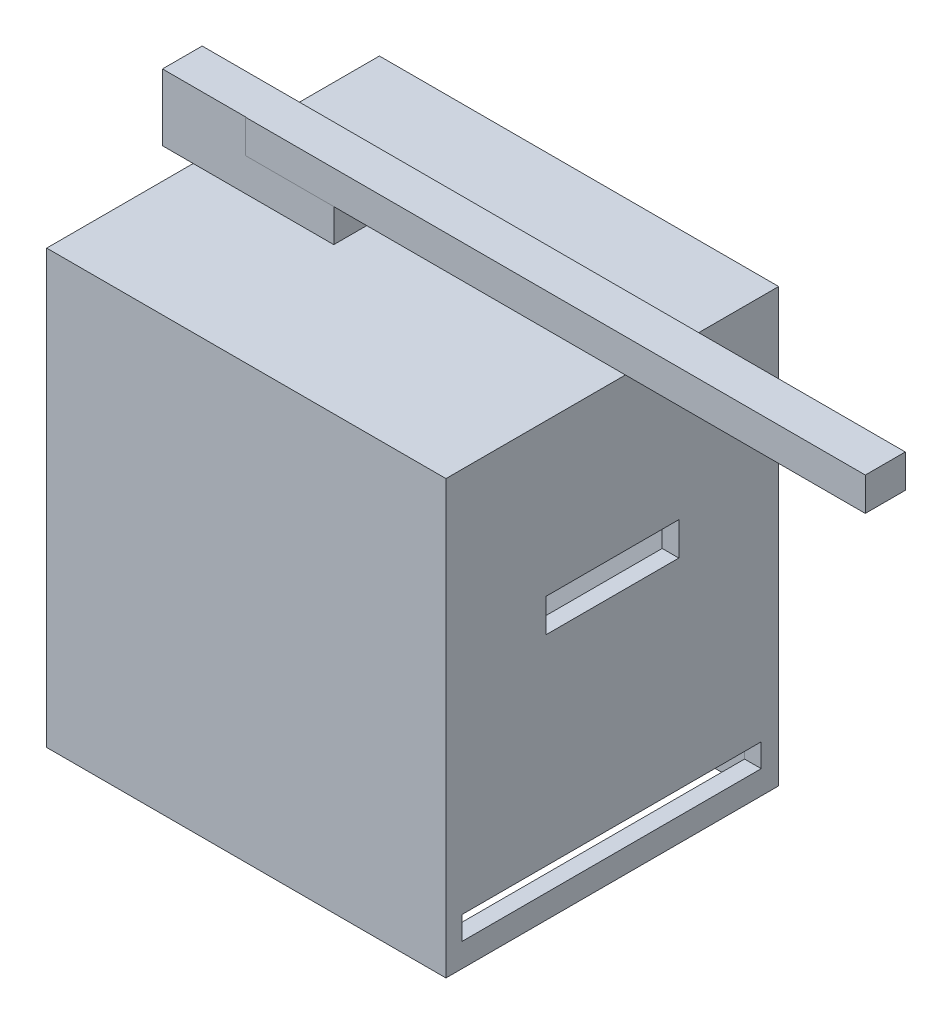
ISO-10303-21;
HEADER;
FILE_DESCRIPTION(('STEP AP214'),'2;1');
FILE_NAME('part.step','',(''),(''),'','','');
FILE_SCHEMA(('AUTOMOTIVE_DESIGN { 1 0 10303 214 1 1 1 1 }'));
ENDSEC;
DATA;
#1=APPLICATION_CONTEXT('core data for automotive mechanical design processes');
#2=APPLICATION_PROTOCOL_DEFINITION('international standard','automotive_design',2000,#1);
#3=PRODUCT_CONTEXT('',#1,'mechanical');
#4=PRODUCT('Part','Part','',(#3));
#5=PRODUCT_RELATED_PRODUCT_CATEGORY('part','',(#4));
#6=PRODUCT_DEFINITION_FORMATION('','',#4);
#7=PRODUCT_DEFINITION_CONTEXT('part definition',#1,'design');
#8=PRODUCT_DEFINITION('design','',#6,#7);
#9=PRODUCT_DEFINITION_SHAPE('','',#8);
#10=(LENGTH_UNIT() NAMED_UNIT(*) SI_UNIT(.MILLI.,.METRE.));
#11=(NAMED_UNIT(*) PLANE_ANGLE_UNIT() SI_UNIT($,.RADIAN.));
#12=(NAMED_UNIT(*) SI_UNIT($,.STERADIAN.) SOLID_ANGLE_UNIT());
#13=UNCERTAINTY_MEASURE_WITH_UNIT(LENGTH_MEASURE(1.E-05),#10,'distance_accuracy_value','');
#14=(GEOMETRIC_REPRESENTATION_CONTEXT(3) GLOBAL_UNCERTAINTY_ASSIGNED_CONTEXT((#13)) GLOBAL_UNIT_ASSIGNED_CONTEXT((#10,
#11,#12)) REPRESENTATION_CONTEXT('',''));
#15=CARTESIAN_POINT('',(0.,0.,0.));
#16=DIRECTION('',(0.,0.,1.));
#17=DIRECTION('',(1.,0.,0.));
#18=AXIS2_PLACEMENT_3D('',#15,#16,#17);
#19=CARTESIAN_POINT('',(-27.5,50.,22.5));
#20=DIRECTION('',(0.,0.,-1.));
#21=DIRECTION('',(-1.,0.,0.));
#22=AXIS2_PLACEMENT_3D('',#19,#20,#21);
#23=PLANE('',#22);
#24=DIRECTION('',(-1.,0.,0.));
#25=VECTOR('',#24,1.);
#26=CARTESIAN_POINT('',(-27.5,-6.44544009362118,22.5));
#27=LINE('',#26,#25);
#28=CARTESIAN_POINT('',(27.5,-6.44544009362118,22.5));
#29=VERTEX_POINT('',#28);
#30=CARTESIAN_POINT('',(-27.5,-6.44544009362118,22.5));
#31=VERTEX_POINT('',#30);
#32=EDGE_CURVE('E435',#29,#31,#27,.T.);
#33=ORIENTED_EDGE('',*,*,#32,.F.);
#34=DIRECTION('',(0.,-1.,0.));
#35=VECTOR('',#34,1.);
#36=CARTESIAN_POINT('',(27.5,50.,22.5));
#37=LINE('',#36,#35);
#38=CARTESIAN_POINT('',(27.5,-10.,22.5));
#39=VERTEX_POINT('',#38);
#40=EDGE_CURVE('E413',#29,#39,#37,.T.);
#41=ORIENTED_EDGE('',*,*,#40,.T.);
#42=DIRECTION('',(-1.,0.,0.));
#43=VECTOR('',#42,1.);
#44=CARTESIAN_POINT('',(-27.5,-10.,22.5));
#45=LINE('',#44,#43);
#46=CARTESIAN_POINT('',(-27.5,-10.,22.5));
#47=VERTEX_POINT('',#46);
#48=EDGE_CURVE('E273',#39,#47,#45,.T.);
#49=ORIENTED_EDGE('',*,*,#48,.T.);
#50=DIRECTION('',(0.,-1.,0.));
#51=VECTOR('',#50,1.);
#52=CARTESIAN_POINT('',(-27.5,50.,22.5));
#53=LINE('',#52,#51);
#54=EDGE_CURVE('E416',#31,#47,#53,.T.);
#55=ORIENTED_EDGE('',*,*,#54,.F.);
#56=EDGE_LOOP('',(#33,#41,#49,#55));
#57=FACE_BOUND('',#56,.T.);
#58=ADVANCED_FACE('F41',(#57),#23,.T.);
#59=CARTESIAN_POINT('',(-8.87484128548977,65.,2.98343540686119));
#60=DIRECTION('',(-1.,0.,0.));
#61=DIRECTION('',(0.,0.,1.));
#62=AXIS2_PLACEMENT_3D('',#59,#60,#61);
#63=PLANE('',#62);
#64=DIRECTION('',(0.,0.,-1.));
#65=VECTOR('',#64,1.);
#66=CARTESIAN_POINT('',(-8.87484128548977,60.,2.98343540686119));
#67=LINE('',#66,#65);
#68=CARTESIAN_POINT('',(-8.87484128548977,60.,2.98343540686119));
#69=VERTEX_POINT('',#68);
#70=CARTESIAN_POINT('',(-8.87484128548977,60.,-2.98343540686119));
#71=VERTEX_POINT('',#70);
#72=EDGE_CURVE('E324',#69,#71,#67,.T.);
#73=ORIENTED_EDGE('',*,*,#72,.F.);
#74=DIRECTION('',(0.,-1.,0.));
#75=VECTOR('',#74,1.);
#76=CARTESIAN_POINT('',(-8.87484128548977,65.,2.98343540686119));
#77=LINE('',#76,#75);
#78=CARTESIAN_POINT('',(-8.87484128548977,55.,2.98343540686119));
#79=VERTEX_POINT('',#78);
#80=EDGE_CURVE('E335',#69,#79,#77,.T.);
#81=ORIENTED_EDGE('',*,*,#80,.T.);
#82=DIRECTION('',(0.,0.,-1.));
#83=VECTOR('',#82,1.);
#84=CARTESIAN_POINT('',(-8.87484128548977,55.,2.98343540686119));
#85=LINE('',#84,#83);
#86=CARTESIAN_POINT('',(-8.87484128548977,55.,-2.98343540686119));
#87=VERTEX_POINT('',#86);
#88=EDGE_CURVE('E326',#79,#87,#85,.T.);
#89=ORIENTED_EDGE('',*,*,#88,.T.);
#90=DIRECTION('',(0.,-1.,0.));
#91=VECTOR('',#90,1.);
#92=CARTESIAN_POINT('',(-8.87484128548977,65.,-2.98343540686119));
#93=LINE('',#92,#91);
#94=EDGE_CURVE('E354',#71,#87,#93,.T.);
#95=ORIENTED_EDGE('',*,*,#94,.F.);
#96=EDGE_LOOP('',(#73,#81,#89,#95));
#97=FACE_BOUND('',#96,.T.);
#98=ADVANCED_FACE('F500',(#97),#63,.F.);
#99=CARTESIAN_POINT('',(30.,50.,-25.));
#100=DIRECTION('',(-1.,0.,0.));
#101=DIRECTION('',(0.,0.,1.));
#102=AXIS2_PLACEMENT_3D('',#99,#100,#101);
#103=PLANE('',#102);
#104=DIRECTION('',(0.,0.,1.));
#105=VECTOR('',#104,1.);
#106=CARTESIAN_POINT('',(30.,-6.44544009362118,-25.));
#107=LINE('',#106,#105);
#108=CARTESIAN_POINT('',(30.,-6.44544009362118,-22.3804228502781));
#109=VERTEX_POINT('',#108);
#110=CARTESIAN_POINT('',(30.,-6.44544009362118,22.6195771497219));
#111=VERTEX_POINT('',#110);
#112=EDGE_CURVE('E257',#109,#111,#107,.T.);
#113=ORIENTED_EDGE('',*,*,#112,.T.);
#114=DIRECTION('',(0.,1.,0.));
#115=VECTOR('',#114,1.);
#116=CARTESIAN_POINT('',(30.,50.,22.6195771497219));
#117=LINE('',#116,#115);
#118=CARTESIAN_POINT('',(30.,-2.94544009362118,22.6195771497219));
#119=VERTEX_POINT('',#118);
#120=EDGE_CURVE('E267',#111,#119,#117,.T.);
#121=ORIENTED_EDGE('',*,*,#120,.T.);
#122=DIRECTION('',(0.,0.,-1.));
#123=VECTOR('',#122,1.);
#124=CARTESIAN_POINT('',(30.,-2.94544009362118,-25.));
#125=LINE('',#124,#123);
#126=CARTESIAN_POINT('',(30.,-2.94544009362118,-22.3804228502781));
#127=VERTEX_POINT('',#126);
#128=EDGE_CURVE('E457',#119,#127,#125,.T.);
#129=ORIENTED_EDGE('',*,*,#128,.T.);
#130=DIRECTION('',(0.,-1.,0.));
#131=VECTOR('',#130,1.);
#132=CARTESIAN_POINT('',(30.,50.,-22.3804228502781));
#133=LINE('',#132,#131);
#134=EDGE_CURVE('E246',#127,#109,#133,.T.);
#135=ORIENTED_EDGE('',*,*,#134,.T.);
#136=EDGE_LOOP('',(#113,#121,#129,#135));
#137=FACE_BOUND('',#136,.T.);
#138=DIRECTION('',(0.,0.,1.));
#139=VECTOR('',#138,1.);
#140=CARTESIAN_POINT('',(30.,32.1562463902296,9.99999999999999));
#141=LINE('',#140,#139);
#142=CARTESIAN_POINT('',(30.,32.1562463902296,-10.));
#143=VERTEX_POINT('',#142);
#144=CARTESIAN_POINT('',(30.,32.1562463902296,9.99999999999999));
#145=VERTEX_POINT('',#144);
#146=EDGE_CURVE('E369',#143,#145,#141,.T.);
#147=ORIENTED_EDGE('',*,*,#146,.F.);
#148=DIRECTION('',(0.,1.,0.));
#149=VECTOR('',#148,1.);
#150=CARTESIAN_POINT('',(30.,32.1562463902296,-10.));
#151=LINE('',#150,#149);
#152=CARTESIAN_POINT('',(30.,27.1562463902296,-10.));
#153=VERTEX_POINT('',#152);
#154=EDGE_CURVE('E372',#153,#143,#151,.T.);
#155=ORIENTED_EDGE('',*,*,#154,.F.);
#156=DIRECTION('',(0.,0.,-1.));
#157=VECTOR('',#156,1.);
#158=CARTESIAN_POINT('',(30.,27.1562463902296,9.99999999999999));
#159=LINE('',#158,#157);
#160=CARTESIAN_POINT('',(30.,27.1562463902296,9.99999999999999));
#161=VERTEX_POINT('',#160);
#162=EDGE_CURVE('E362',#161,#153,#159,.T.);
#163=ORIENTED_EDGE('',*,*,#162,.F.);
#164=DIRECTION('',(0.,-1.,0.));
#165=VECTOR('',#164,1.);
#166=CARTESIAN_POINT('',(30.,32.1562463902296,9.99999999999999));
#167=LINE('',#166,#165);
#168=EDGE_CURVE('E366',#145,#161,#167,.T.);
#169=ORIENTED_EDGE('',*,*,#168,.F.);
#170=EDGE_LOOP('',(#147,#155,#163,#169));
#171=FACE_BOUND('',#170,.T.);
#172=DIRECTION('',(0.,-1.,0.));
#173=VECTOR('',#172,1.);
#174=CARTESIAN_POINT('',(30.,50.,25.));
#175=LINE('',#174,#173);
#176=CARTESIAN_POINT('',(30.,55.,25.));
#177=VERTEX_POINT('',#176);
#178=CARTESIAN_POINT('',(30.,-10.,25.));
#179=VERTEX_POINT('',#178);
#180=EDGE_CURVE('E424',#177,#179,#175,.T.);
#181=ORIENTED_EDGE('',*,*,#180,.T.);
#182=DIRECTION('',(0.,0.,1.));
#183=VECTOR('',#182,1.);
#184=CARTESIAN_POINT('',(30.,-10.,25.));
#185=LINE('',#184,#183);
#186=CARTESIAN_POINT('',(30.,-10.,-25.));
#187=VERTEX_POINT('',#186);
#188=EDGE_CURVE('E282',#187,#179,#185,.T.);
#189=ORIENTED_EDGE('',*,*,#188,.F.);
#190=DIRECTION('',(0.,-1.,0.));
#191=VECTOR('',#190,1.);
#192=CARTESIAN_POINT('',(30.,50.,-25.));
#193=LINE('',#192,#191);
#194=CARTESIAN_POINT('',(30.,55.,-25.));
#195=VERTEX_POINT('',#194);
#196=EDGE_CURVE('E430',#195,#187,#193,.T.);
#197=ORIENTED_EDGE('',*,*,#196,.F.);
#198=DIRECTION('',(0.,0.,-1.));
#199=VECTOR('',#198,1.);
#200=CARTESIAN_POINT('',(30.,55.,-25.));
#201=LINE('',#200,#199);
#202=EDGE_CURVE('E365',#177,#195,#201,.T.);
#203=ORIENTED_EDGE('',*,*,#202,.F.);
#204=EDGE_LOOP('',(#181,#189,#197,#203));
#205=FACE_BOUND('',#204,.T.);
#206=ADVANCED_FACE('F43',(#137,#171,#205),#103,.F.);
#207=CARTESIAN_POINT('',(-30.,50.,-25.));
#208=DIRECTION('',(0.,0.,1.));
#209=DIRECTION('',(1.,0.,0.));
#210=AXIS2_PLACEMENT_3D('',#207,#208,#209);
#211=PLANE('',#210);
#212=ORIENTED_EDGE('',*,*,#196,.T.);
#213=DIRECTION('',(1.,0.,0.));
#214=VECTOR('',#213,1.);
#215=CARTESIAN_POINT('',(-30.,-10.,-25.));
#216=LINE('',#215,#214);
#217=CARTESIAN_POINT('',(-30.,-10.,-25.));
#218=VERTEX_POINT('',#217);
#219=EDGE_CURVE('E291',#218,#187,#216,.T.);
#220=ORIENTED_EDGE('',*,*,#219,.F.);
#221=DIRECTION('',(0.,-1.,0.));
#222=VECTOR('',#221,1.);
#223=CARTESIAN_POINT('',(-30.,50.,-25.));
#224=LINE('',#223,#222);
#225=CARTESIAN_POINT('',(-30.,55.,-25.));
#226=VERTEX_POINT('',#225);
#227=EDGE_CURVE('E428',#226,#218,#224,.T.);
#228=ORIENTED_EDGE('',*,*,#227,.F.);
#229=DIRECTION('',(-1.,0.,0.));
#230=VECTOR('',#229,1.);
#231=CARTESIAN_POINT('',(-30.,55.,-25.));
#232=LINE('',#231,#230);
#233=EDGE_CURVE('E391',#195,#226,#232,.T.);
#234=ORIENTED_EDGE('',*,*,#233,.F.);
#235=EDGE_LOOP('',(#212,#220,#228,#234));
#236=FACE_BOUND('',#235,.T.);
#237=ADVANCED_FACE('F509',(#236),#211,.F.);
#238=CARTESIAN_POINT('',(-30.,50.,-25.));
#239=DIRECTION('',(1.,0.,0.));
#240=DIRECTION('',(0.,0.,-1.));
#241=AXIS2_PLACEMENT_3D('',#238,#239,#240);
#242=PLANE('',#241);
#243=DIRECTION('',(0.,0.,1.));
#244=VECTOR('',#243,1.);
#245=CARTESIAN_POINT('',(-30.,-2.94544009362118,-25.));
#246=LINE('',#245,#244);
#247=CARTESIAN_POINT('',(-30.,-2.94544009362118,-22.3804228502781));
#248=VERTEX_POINT('',#247);
#249=CARTESIAN_POINT('',(-30.,-2.94544009362118,22.6195771497219));
#250=VERTEX_POINT('',#249);
#251=EDGE_CURVE('E237',#248,#250,#246,.T.);
#252=ORIENTED_EDGE('',*,*,#251,.T.);
#253=DIRECTION('',(0.,-1.,0.));
#254=VECTOR('',#253,1.);
#255=CARTESIAN_POINT('',(-30.,50.,22.6195771497219));
#256=LINE('',#255,#254);
#257=CARTESIAN_POINT('',(-30.,-6.44544009362118,22.6195771497219));
#258=VERTEX_POINT('',#257);
#259=EDGE_CURVE('E11',#250,#258,#256,.T.);
#260=ORIENTED_EDGE('',*,*,#259,.T.);
#261=DIRECTION('',(0.,0.,-1.));
#262=VECTOR('',#261,1.);
#263=CARTESIAN_POINT('',(-30.,-6.44544009362118,-25.));
#264=LINE('',#263,#262);
#265=CARTESIAN_POINT('',(-30.,-6.44544009362118,-22.3804228502781));
#266=VERTEX_POINT('',#265);
#267=EDGE_CURVE('E262',#258,#266,#264,.T.);
#268=ORIENTED_EDGE('',*,*,#267,.T.);
#269=DIRECTION('',(0.,1.,0.));
#270=VECTOR('',#269,1.);
#271=CARTESIAN_POINT('',(-30.,50.,-22.3804228502781));
#272=LINE('',#271,#270);
#273=EDGE_CURVE('E256',#266,#248,#272,.T.);
#274=ORIENTED_EDGE('',*,*,#273,.T.);
#275=EDGE_LOOP('',(#252,#260,#268,#274));
#276=FACE_BOUND('',#275,.T.);
#277=ORIENTED_EDGE('',*,*,#227,.T.);
#278=DIRECTION('',(0.,0.,-1.));
#279=VECTOR('',#278,1.);
#280=CARTESIAN_POINT('',(-30.,-10.,25.));
#281=LINE('',#280,#279);
#282=CARTESIAN_POINT('',(-30.,-10.,25.));
#283=VERTEX_POINT('',#282);
#284=EDGE_CURVE('E288',#283,#218,#281,.T.);
#285=ORIENTED_EDGE('',*,*,#284,.F.);
#286=DIRECTION('',(0.,-1.,0.));
#287=VECTOR('',#286,1.);
#288=CARTESIAN_POINT('',(-30.,50.,25.));
#289=LINE('',#288,#287);
#290=CARTESIAN_POINT('',(-30.,55.,25.));
#291=VERTEX_POINT('',#290);
#292=EDGE_CURVE('E426',#291,#283,#289,.T.);
#293=ORIENTED_EDGE('',*,*,#292,.F.);
#294=DIRECTION('',(0.,0.,1.));
#295=VECTOR('',#294,1.);
#296=CARTESIAN_POINT('',(-30.,55.,-25.));
#297=LINE('',#296,#295);
#298=CARTESIAN_POINT('',(-30.,55.,2.98343540686119));
#299=VERTEX_POINT('',#298);
#300=EDGE_CURVE('E394',#299,#291,#297,.T.);
#301=ORIENTED_EDGE('',*,*,#300,.F.);
#302=CARTESIAN_POINT('',(-30.,55.,-2.98343540686119));
#303=VERTEX_POINT('',#302);
#304=EDGE_CURVE('E398',#303,#299,#297,.T.);
#305=ORIENTED_EDGE('',*,*,#304,.F.);
#306=EDGE_CURVE('E395',#226,#303,#297,.T.);
#307=ORIENTED_EDGE('',*,*,#306,.F.);
#308=EDGE_LOOP('',(#277,#285,#293,#301,#305,#307));
#309=FACE_BOUND('',#308,.T.);
#310=ADVANCED_FACE('F463',(#276,#309),#242,.F.);
#311=CARTESIAN_POINT('',(-30.,50.,25.));
#312=DIRECTION('',(0.,0.,-1.));
#313=DIRECTION('',(-1.,0.,0.));
#314=AXIS2_PLACEMENT_3D('',#311,#312,#313);
#315=PLANE('',#314);
#316=ORIENTED_EDGE('',*,*,#292,.T.);
#317=DIRECTION('',(-1.,0.,0.));
#318=VECTOR('',#317,1.);
#319=CARTESIAN_POINT('',(-30.,-10.,25.));
#320=LINE('',#319,#318);
#321=EDGE_CURVE('E285',#179,#283,#320,.T.);
#322=ORIENTED_EDGE('',*,*,#321,.F.);
#323=ORIENTED_EDGE('',*,*,#180,.F.);
#324=DIRECTION('',(1.,0.,0.));
#325=VECTOR('',#324,1.);
#326=CARTESIAN_POINT('',(-30.,55.,25.));
#327=LINE('',#326,#325);
#328=EDGE_CURVE('E397',#291,#177,#327,.T.);
#329=ORIENTED_EDGE('',*,*,#328,.F.);
#330=EDGE_LOOP('',(#316,#322,#323,#329));
#331=FACE_BOUND('',#330,.T.);
#332=ADVANCED_FACE('F635',(#331),#315,.F.);
#333=CARTESIAN_POINT('',(27.5,50.,-22.5));
#334=DIRECTION('',(-1.,0.,0.));
#335=DIRECTION('',(0.,0.,1.));
#336=AXIS2_PLACEMENT_3D('',#333,#334,#335);
#337=PLANE('',#336);
#338=DIRECTION('',(0.,0.,1.));
#339=VECTOR('',#338,1.);
#340=CARTESIAN_POINT('',(27.5,-6.44544009362118,-22.5));
#341=LINE('',#340,#339);
#342=CARTESIAN_POINT('',(27.5,-6.44544009362118,-22.3804228502781));
#343=VERTEX_POINT('',#342);
#344=EDGE_CURVE('E255',#343,#29,#341,.T.);
#345=ORIENTED_EDGE('',*,*,#344,.F.);
#346=DIRECTION('',(0.,-1.,0.));
#347=VECTOR('',#346,1.);
#348=CARTESIAN_POINT('',(27.5,50.,-22.3804228502781));
#349=LINE('',#348,#347);
#350=CARTESIAN_POINT('',(27.5,-2.94544009362118,-22.3804228502781));
#351=VERTEX_POINT('',#350);
#352=EDGE_CURVE('E243',#351,#343,#349,.T.);
#353=ORIENTED_EDGE('',*,*,#352,.F.);
#354=DIRECTION('',(0.,0.,-1.));
#355=VECTOR('',#354,1.);
#356=CARTESIAN_POINT('',(27.5,-2.94544009362118,-22.5));
#357=LINE('',#356,#355);
#358=CARTESIAN_POINT('',(27.5,-2.94544009362118,22.5));
#359=VERTEX_POINT('',#358);
#360=EDGE_CURVE('E229',#359,#351,#357,.T.);
#361=ORIENTED_EDGE('',*,*,#360,.F.);
#362=CARTESIAN_POINT('',(27.5,50.,22.5));
#363=VERTEX_POINT('',#362);
#364=EDGE_CURVE('E414',#363,#359,#37,.T.);
#365=ORIENTED_EDGE('',*,*,#364,.F.);
#366=DIRECTION('',(0.,0.,-1.));
#367=VECTOR('',#366,1.);
#368=CARTESIAN_POINT('',(27.5,50.,-22.5));
#369=LINE('',#368,#367);
#370=CARTESIAN_POINT('',(27.5,50.,-22.5));
#371=VERTEX_POINT('',#370);
#372=EDGE_CURVE('E401',#363,#371,#369,.T.);
#373=ORIENTED_EDGE('',*,*,#372,.T.);
#374=DIRECTION('',(0.,-1.,0.));
#375=VECTOR('',#374,1.);
#376=CARTESIAN_POINT('',(27.5,50.,-22.5));
#377=LINE('',#376,#375);
#378=CARTESIAN_POINT('',(27.5,-10.,-22.5));
#379=VERTEX_POINT('',#378);
#380=EDGE_CURVE('E422',#371,#379,#377,.T.);
#381=ORIENTED_EDGE('',*,*,#380,.T.);
#382=DIRECTION('',(0.,0.,1.));
#383=VECTOR('',#382,1.);
#384=CARTESIAN_POINT('',(27.5,-10.,22.5));
#385=LINE('',#384,#383);
#386=EDGE_CURVE('E270',#379,#39,#385,.T.);
#387=ORIENTED_EDGE('',*,*,#386,.T.);
#388=ORIENTED_EDGE('',*,*,#40,.F.);
#389=EDGE_LOOP('',(#345,#353,#361,#365,#373,#381,#387,#388));
#390=FACE_BOUND('',#389,.T.);
#391=DIRECTION('',(0.,1.,0.));
#392=VECTOR('',#391,1.);
#393=CARTESIAN_POINT('',(27.5,32.1562463902296,-10.));
#394=LINE('',#393,#392);
#395=CARTESIAN_POINT('',(27.5,27.1562463902296,-10.));
#396=VERTEX_POINT('',#395);
#397=CARTESIAN_POINT('',(27.5,32.1562463902296,-10.));
#398=VERTEX_POINT('',#397);
#399=EDGE_CURVE('E356',#396,#398,#394,.T.);
#400=ORIENTED_EDGE('',*,*,#399,.T.);
#401=DIRECTION('',(0.,0.,1.));
#402=VECTOR('',#401,1.);
#403=CARTESIAN_POINT('',(27.5,32.1562463902296,10.));
#404=LINE('',#403,#402);
#405=CARTESIAN_POINT('',(27.5,32.1562463902296,9.99999999999999));
#406=VERTEX_POINT('',#405);
#407=EDGE_CURVE('E357',#398,#406,#404,.T.);
#408=ORIENTED_EDGE('',*,*,#407,.T.);
#409=DIRECTION('',(0.,-1.,0.));
#410=VECTOR('',#409,1.);
#411=CARTESIAN_POINT('',(27.5,32.1562463902296,9.99999999999999));
#412=LINE('',#411,#410);
#413=CARTESIAN_POINT('',(27.5,27.1562463902296,9.99999999999999));
#414=VERTEX_POINT('',#413);
#415=EDGE_CURVE('E381',#406,#414,#412,.T.);
#416=ORIENTED_EDGE('',*,*,#415,.T.);
#417=DIRECTION('',(0.,0.,-1.));
#418=VECTOR('',#417,1.);
#419=CARTESIAN_POINT('',(27.5,27.1562463902296,10.));
#420=LINE('',#419,#418);
#421=EDGE_CURVE('E377',#414,#396,#420,.T.);
#422=ORIENTED_EDGE('',*,*,#421,.T.);
#423=EDGE_LOOP('',(#400,#408,#416,#422));
#424=FACE_BOUND('',#423,.T.);
#425=ADVANCED_FACE('F252',(#390,#424),#337,.T.);
#426=CARTESIAN_POINT('',(-27.5,50.,-22.5));
#427=DIRECTION('',(0.,0.,1.));
#428=DIRECTION('',(1.,0.,0.));
#429=AXIS2_PLACEMENT_3D('',#426,#427,#428);
#430=PLANE('',#429);
#431=DIRECTION('',(0.,-1.,0.));
#432=VECTOR('',#431,1.);
#433=CARTESIAN_POINT('',(-27.5,50.,-22.5));
#434=LINE('',#433,#432);
#435=CARTESIAN_POINT('',(-27.5,50.,-22.5));
#436=VERTEX_POINT('',#435);
#437=CARTESIAN_POINT('',(-27.5,-10.,-22.5));
#438=VERTEX_POINT('',#437);
#439=EDGE_CURVE('E420',#436,#438,#434,.T.);
#440=ORIENTED_EDGE('',*,*,#439,.T.);
#441=DIRECTION('',(1.,0.,0.));
#442=VECTOR('',#441,1.);
#443=CARTESIAN_POINT('',(-27.5,-10.,-22.5));
#444=LINE('',#443,#442);
#445=EDGE_CURVE('E279',#438,#379,#444,.T.);
#446=ORIENTED_EDGE('',*,*,#445,.T.);
#447=ORIENTED_EDGE('',*,*,#380,.F.);
#448=DIRECTION('',(-1.,0.,0.));
#449=VECTOR('',#448,1.);
#450=CARTESIAN_POINT('',(-27.5,50.,-22.5));
#451=LINE('',#450,#449);
#452=EDGE_CURVE('E404',#371,#436,#451,.T.);
#453=ORIENTED_EDGE('',*,*,#452,.T.);
#454=EDGE_LOOP('',(#440,#446,#447,#453));
#455=FACE_BOUND('',#454,.T.);
#456=ADVANCED_FACE('F485',(#455),#430,.T.);
#457=CARTESIAN_POINT('',(-27.5,50.,-22.5));
#458=DIRECTION('',(1.,0.,0.));
#459=DIRECTION('',(0.,0.,-1.));
#460=AXIS2_PLACEMENT_3D('',#457,#458,#459);
#461=PLANE('',#460);
#462=DIRECTION('',(0.,0.,-1.));
#463=VECTOR('',#462,1.);
#464=CARTESIAN_POINT('',(-27.5,-6.44544009362118,-22.5));
#465=LINE('',#464,#463);
#466=CARTESIAN_POINT('',(-27.5,-6.44544009362118,-22.3804228502781));
#467=VERTEX_POINT('',#466);
#468=EDGE_CURVE('E459',#31,#467,#465,.T.);
#469=ORIENTED_EDGE('',*,*,#468,.F.);
#470=ORIENTED_EDGE('',*,*,#54,.T.);
#471=DIRECTION('',(0.,0.,-1.));
#472=VECTOR('',#471,1.);
#473=CARTESIAN_POINT('',(-27.5,-10.,22.5));
#474=LINE('',#473,#472);
#475=EDGE_CURVE('E276',#47,#438,#474,.T.);
#476=ORIENTED_EDGE('',*,*,#475,.T.);
#477=ORIENTED_EDGE('',*,*,#439,.F.);
#478=DIRECTION('',(0.,0.,1.));
#479=VECTOR('',#478,1.);
#480=CARTESIAN_POINT('',(-27.5,50.,-22.5));
#481=LINE('',#480,#479);
#482=CARTESIAN_POINT('',(-27.5,50.,22.5));
#483=VERTEX_POINT('',#482);
#484=EDGE_CURVE('E407',#436,#483,#481,.T.);
#485=ORIENTED_EDGE('',*,*,#484,.T.);
#486=CARTESIAN_POINT('',(-27.5,-2.94544009362118,22.5));
#487=VERTEX_POINT('',#486);
#488=EDGE_CURVE('E417',#483,#487,#53,.T.);
#489=ORIENTED_EDGE('',*,*,#488,.T.);
#490=DIRECTION('',(0.,0.,1.));
#491=VECTOR('',#490,1.);
#492=CARTESIAN_POINT('',(-27.5,-2.94544009362118,-22.5));
#493=LINE('',#492,#491);
#494=CARTESIAN_POINT('',(-27.5,-2.94544009362118,-22.3804228502781));
#495=VERTEX_POINT('',#494);
#496=EDGE_CURVE('E238',#495,#487,#493,.T.);
#497=ORIENTED_EDGE('',*,*,#496,.F.);
#498=DIRECTION('',(0.,1.,0.));
#499=VECTOR('',#498,1.);
#500=CARTESIAN_POINT('',(-27.5,50.,-22.3804228502781));
#501=LINE('',#500,#499);
#502=EDGE_CURVE('E49',#467,#495,#501,.T.);
#503=ORIENTED_EDGE('',*,*,#502,.F.);
#504=EDGE_LOOP('',(#469,#470,#476,#477,#485,#489,#497,#503));
#505=FACE_BOUND('',#504,.T.);
#506=ADVANCED_FACE('F447',(#505),#461,.T.);
#507=DIRECTION('',(1.,0.,0.));
#508=VECTOR('',#507,1.);
#509=CARTESIAN_POINT('',(-27.5,-2.94544009362118,22.5));
#510=LINE('',#509,#508);
#511=EDGE_CURVE('E232',#487,#359,#510,.T.);
#512=ORIENTED_EDGE('',*,*,#511,.F.);
#513=ORIENTED_EDGE('',*,*,#488,.F.);
#514=DIRECTION('',(1.,0.,0.));
#515=VECTOR('',#514,1.);
#516=CARTESIAN_POINT('',(-27.5,50.,22.5));
#517=LINE('',#516,#515);
#518=EDGE_CURVE('E410',#483,#363,#517,.T.);
#519=ORIENTED_EDGE('',*,*,#518,.T.);
#520=ORIENTED_EDGE('',*,*,#364,.T.);
#521=EDGE_LOOP('',(#512,#513,#519,#520));
#522=FACE_BOUND('',#521,.T.);
#523=ADVANCED_FACE('F489',(#522),#23,.T.);
#524=CARTESIAN_POINT('',(0.,50.,0.));
#525=DIRECTION('',(0.,1.,0.));
#526=DIRECTION('',(0.,0.,1.));
#527=AXIS2_PLACEMENT_3D('',#524,#525,#526);
#528=PLANE('',#527);
#529=ORIENTED_EDGE('',*,*,#452,.F.);
#530=ORIENTED_EDGE('',*,*,#372,.F.);
#531=ORIENTED_EDGE('',*,*,#518,.F.);
#532=ORIENTED_EDGE('',*,*,#484,.F.);
#533=EDGE_LOOP('',(#529,#530,#531,#532));
#534=FACE_BOUND('',#533,.T.);
#535=ADVANCED_FACE('F487',(#534),#528,.F.);
#536=CARTESIAN_POINT('',(0.,55.,0.));
#537=DIRECTION('',(0.,1.,0.));
#538=DIRECTION('',(0.,0.,1.));
#539=AXIS2_PLACEMENT_3D('',#536,#537,#538);
#540=PLANE('',#539);
#541=DIRECTION('',(1.,0.,0.));
#542=VECTOR('',#541,1.);
#543=CARTESIAN_POINT('',(-34.617840995395,55.,2.98343540686119));
#544=LINE('',#543,#542);
#545=EDGE_CURVE('E346',#299,#79,#544,.T.);
#546=ORIENTED_EDGE('',*,*,#545,.F.);
#547=ORIENTED_EDGE('',*,*,#300,.T.);
#548=ORIENTED_EDGE('',*,*,#328,.T.);
#549=ORIENTED_EDGE('',*,*,#202,.T.);
#550=ORIENTED_EDGE('',*,*,#233,.T.);
#551=ORIENTED_EDGE('',*,*,#306,.T.);
#552=DIRECTION('',(-1.,0.,0.));
#553=VECTOR('',#552,1.);
#554=CARTESIAN_POINT('',(-34.617840995395,55.,-2.98343540686119));
#555=LINE('',#554,#553);
#556=EDGE_CURVE('E339',#87,#303,#555,.T.);
#557=ORIENTED_EDGE('',*,*,#556,.F.);
#558=ORIENTED_EDGE('',*,*,#88,.F.);
#559=EDGE_LOOP('',(#546,#547,#548,#549,#550,#551,#557,#558));
#560=FACE_BOUND('',#559,.T.);
#561=ADVANCED_FACE('F496',(#560),#540,.T.);
#562=CARTESIAN_POINT('',(-30.001,32.1562463902296,-9.99999999999999));
#563=DIRECTION('',(0.,0.,-1.));
#564=DIRECTION('',(0.,1.,0.));
#565=AXIS2_PLACEMENT_3D('',#562,#563,#564);
#566=PLANE('',#565);
#567=DIRECTION('',(1.,0.,0.));
#568=VECTOR('',#567,1.);
#569=CARTESIAN_POINT('',(-30.001,27.1562463902296,-9.99999999999999));
#570=LINE('',#569,#568);
#571=EDGE_CURVE('E380',#396,#153,#570,.T.);
#572=ORIENTED_EDGE('',*,*,#571,.T.);
#573=ORIENTED_EDGE('',*,*,#154,.T.);
#574=DIRECTION('',(1.,0.,0.));
#575=VECTOR('',#574,1.);
#576=CARTESIAN_POINT('',(-30.001,32.1562463902296,-9.99999999999999));
#577=LINE('',#576,#575);
#578=EDGE_CURVE('E376',#398,#143,#577,.T.);
#579=ORIENTED_EDGE('',*,*,#578,.F.);
#580=ORIENTED_EDGE('',*,*,#399,.F.);
#581=EDGE_LOOP('',(#572,#573,#579,#580));
#582=FACE_BOUND('',#581,.T.);
#583=ADVANCED_FACE('F526',(#582),#566,.F.);
#584=CARTESIAN_POINT('',(-30.001,27.1562463902296,10.));
#585=DIRECTION('',(0.,-1.,0.));
#586=DIRECTION('',(0.,0.,-1.));
#587=AXIS2_PLACEMENT_3D('',#584,#585,#586);
#588=PLANE('',#587);
#589=DIRECTION('',(1.,0.,0.));
#590=VECTOR('',#589,1.);
#591=CARTESIAN_POINT('',(-30.001,27.1562463902296,10.));
#592=LINE('',#591,#590);
#593=EDGE_CURVE('E361',#414,#161,#592,.T.);
#594=ORIENTED_EDGE('',*,*,#593,.T.);
#595=ORIENTED_EDGE('',*,*,#162,.T.);
#596=ORIENTED_EDGE('',*,*,#571,.F.);
#597=ORIENTED_EDGE('',*,*,#421,.F.);
#598=EDGE_LOOP('',(#594,#595,#596,#597));
#599=FACE_BOUND('',#598,.T.);
#600=ADVANCED_FACE('F522',(#599),#588,.F.);
#601=CARTESIAN_POINT('',(-30.001,32.1562463902296,10.));
#602=DIRECTION('',(0.,0.,1.));
#603=DIRECTION('',(1.,0.,0.));
#604=AXIS2_PLACEMENT_3D('',#601,#602,#603);
#605=PLANE('',#604);
#606=DIRECTION('',(1.,0.,0.));
#607=VECTOR('',#606,1.);
#608=CARTESIAN_POINT('',(-30.001,32.1562463902296,10.));
#609=LINE('',#608,#607);
#610=EDGE_CURVE('E360',#406,#145,#609,.T.);
#611=ORIENTED_EDGE('',*,*,#610,.T.);
#612=ORIENTED_EDGE('',*,*,#168,.T.);
#613=ORIENTED_EDGE('',*,*,#593,.F.);
#614=ORIENTED_EDGE('',*,*,#415,.F.);
#615=EDGE_LOOP('',(#611,#612,#613,#614));
#616=FACE_BOUND('',#615,.T.);
#617=ADVANCED_FACE('F518',(#616),#605,.F.);
#618=CARTESIAN_POINT('',(-30.001,32.1562463902296,10.));
#619=DIRECTION('',(0.,1.,0.));
#620=DIRECTION('',(0.,0.,1.));
#621=AXIS2_PLACEMENT_3D('',#618,#619,#620);
#622=PLANE('',#621);
#623=ORIENTED_EDGE('',*,*,#578,.T.);
#624=ORIENTED_EDGE('',*,*,#146,.T.);
#625=ORIENTED_EDGE('',*,*,#610,.F.);
#626=ORIENTED_EDGE('',*,*,#407,.F.);
#627=EDGE_LOOP('',(#623,#624,#625,#626));
#628=FACE_BOUND('',#627,.T.);
#629=ADVANCED_FACE('F515',(#628),#622,.F.);
#630=CARTESIAN_POINT('',(-34.617840995395,65.,-2.98343540686119));
#631=DIRECTION('',(0.,0.,1.));
#632=DIRECTION('',(1.,0.,0.));
#633=AXIS2_PLACEMENT_3D('',#630,#631,#632);
#634=PLANE('',#633);
#635=DIRECTION('',(0.,-1.,0.));
#636=VECTOR('',#635,1.);
#637=CARTESIAN_POINT('',(-34.617840995395,65.,-2.98343540686119));
#638=LINE('',#637,#636);
#639=CARTESIAN_POINT('',(-34.617840995395,65.,-2.98343540686119));
#640=VERTEX_POINT('',#639);
#641=CARTESIAN_POINT('',(-34.617840995395,55.,-2.98343540686119));
#642=VERTEX_POINT('',#641);
#643=EDGE_CURVE('E351',#640,#642,#638,.T.);
#644=ORIENTED_EDGE('',*,*,#643,.F.);
#645=DIRECTION('',(-1.,0.,0.));
#646=VECTOR('',#645,1.);
#647=CARTESIAN_POINT('',(-34.617840995395,65.,-2.98343540686119));
#648=LINE('',#647,#646);
#649=CARTESIAN_POINT('',(71.0495075778832,65.,-2.98343540686119));
#650=VERTEX_POINT('',#649);
#651=EDGE_CURVE('E327',#650,#640,#648,.T.);
#652=ORIENTED_EDGE('',*,*,#651,.F.);
#653=DIRECTION('',(0.,1.,0.));
#654=VECTOR('',#653,1.);
#655=CARTESIAN_POINT('',(71.0495075778832,60.,-2.98343540686119));
#656=LINE('',#655,#654);
#657=CARTESIAN_POINT('',(71.0495075778832,60.,-2.98343540686119));
#658=VERTEX_POINT('',#657);
#659=EDGE_CURVE('E314',#658,#650,#656,.T.);
#660=ORIENTED_EDGE('',*,*,#659,.F.);
#661=DIRECTION('',(-1.,0.,0.));
#662=VECTOR('',#661,1.);
#663=CARTESIAN_POINT('',(-22.0682127438889,60.,-2.98343540686119));
#664=LINE('',#663,#662);
#665=EDGE_CURVE('E304',#658,#71,#664,.T.);
#666=ORIENTED_EDGE('',*,*,#665,.T.);
#667=ORIENTED_EDGE('',*,*,#94,.T.);
#668=ORIENTED_EDGE('',*,*,#556,.T.);
#669=EDGE_CURVE('E338',#303,#642,#555,.T.);
#670=ORIENTED_EDGE('',*,*,#669,.T.);
#671=EDGE_LOOP('',(#644,#652,#660,#666,#667,#668,#670));
#672=FACE_BOUND('',#671,.T.);
#673=ADVANCED_FACE('F513',(#672),#634,.F.);
#674=CARTESIAN_POINT('',(-34.617840995395,65.,2.98343540686119));
#675=DIRECTION('',(1.,0.,0.));
#676=DIRECTION('',(0.,0.,-1.));
#677=AXIS2_PLACEMENT_3D('',#674,#675,#676);
#678=PLANE('',#677);
#679=DIRECTION('',(0.,0.,1.));
#680=VECTOR('',#679,1.);
#681=CARTESIAN_POINT('',(-34.617840995395,55.,2.98343540686119));
#682=LINE('',#681,#680);
#683=CARTESIAN_POINT('',(-34.617840995395,55.,2.98343540686119));
#684=VERTEX_POINT('',#683);
#685=EDGE_CURVE('E342',#642,#684,#682,.T.);
#686=ORIENTED_EDGE('',*,*,#685,.T.);
#687=DIRECTION('',(0.,-1.,0.));
#688=VECTOR('',#687,1.);
#689=CARTESIAN_POINT('',(-34.617840995395,65.,2.98343540686119));
#690=LINE('',#689,#688);
#691=CARTESIAN_POINT('',(-34.617840995395,65.,2.98343540686119));
#692=VERTEX_POINT('',#691);
#693=EDGE_CURVE('E348',#692,#684,#690,.T.);
#694=ORIENTED_EDGE('',*,*,#693,.F.);
#695=DIRECTION('',(0.,0.,1.));
#696=VECTOR('',#695,1.);
#697=CARTESIAN_POINT('',(-34.617840995395,65.,2.98343540686119));
#698=LINE('',#697,#696);
#699=EDGE_CURVE('E329',#640,#692,#698,.T.);
#700=ORIENTED_EDGE('',*,*,#699,.F.);
#701=ORIENTED_EDGE('',*,*,#643,.T.);
#702=EDGE_LOOP('',(#686,#694,#700,#701));
#703=FACE_BOUND('',#702,.T.);
#704=ADVANCED_FACE('F558',(#703),#678,.F.);
#705=CARTESIAN_POINT('',(-34.617840995395,65.,2.98343540686119));
#706=DIRECTION('',(0.,0.,-1.));
#707=DIRECTION('',(-1.,0.,0.));
#708=AXIS2_PLACEMENT_3D('',#705,#706,#707);
#709=PLANE('',#708);
#710=DIRECTION('',(1.,0.,0.));
#711=VECTOR('',#710,1.);
#712=CARTESIAN_POINT('',(-34.617840995395,60.,2.98343540686119));
#713=LINE('',#712,#711);
#714=CARTESIAN_POINT('',(-22.0682127438889,60.,2.98343540686119));
#715=VERTEX_POINT('',#714);
#716=EDGE_CURVE('E432',#715,#69,#713,.T.);
#717=ORIENTED_EDGE('',*,*,#716,.F.);
#718=DIRECTION('',(0.,1.,0.));
#719=VECTOR('',#718,1.);
#720=CARTESIAN_POINT('',(-22.0682127438889,65.,2.98343540686119));
#721=LINE('',#720,#719);
#722=CARTESIAN_POINT('',(-22.0682127438889,65.,2.98343540686119));
#723=VERTEX_POINT('',#722);
#724=EDGE_CURVE('E317',#715,#723,#721,.T.);
#725=ORIENTED_EDGE('',*,*,#724,.T.);
#726=DIRECTION('',(1.,0.,0.));
#727=VECTOR('',#726,1.);
#728=CARTESIAN_POINT('',(-34.617840995395,65.,2.98343540686119));
#729=LINE('',#728,#727);
#730=EDGE_CURVE('E332',#692,#723,#729,.T.);
#731=ORIENTED_EDGE('',*,*,#730,.F.);
#732=ORIENTED_EDGE('',*,*,#693,.T.);
#733=EDGE_CURVE('E330',#684,#299,#544,.T.);
#734=ORIENTED_EDGE('',*,*,#733,.T.);
#735=ORIENTED_EDGE('',*,*,#545,.T.);
#736=ORIENTED_EDGE('',*,*,#80,.F.);
#737=EDGE_LOOP('',(#717,#725,#731,#732,#734,#735,#736));
#738=FACE_BOUND('',#737,.T.);
#739=ADVANCED_FACE('F553',(#738),#709,.F.);
#740=CARTESIAN_POINT('',(0.,65.,0.));
#741=DIRECTION('',(0.,-1.,0.));
#742=DIRECTION('',(0.,0.,-1.));
#743=AXIS2_PLACEMENT_3D('',#740,#741,#742);
#744=PLANE('',#743);
#745=DIRECTION('',(0.,0.,-1.));
#746=VECTOR('',#745,1.);
#747=CARTESIAN_POINT('',(71.0495075778832,65.,-2.98343540686119));
#748=LINE('',#747,#746);
#749=CARTESIAN_POINT('',(71.0495075778832,65.,3.02650966300373));
#750=VERTEX_POINT('',#749);
#751=EDGE_CURVE('E298',#750,#650,#748,.T.);
#752=ORIENTED_EDGE('',*,*,#751,.T.);
#753=ORIENTED_EDGE('',*,*,#651,.T.);
#754=ORIENTED_EDGE('',*,*,#699,.T.);
#755=ORIENTED_EDGE('',*,*,#730,.T.);
#756=DIRECTION('',(0.,0.,1.));
#757=VECTOR('',#756,1.);
#758=CARTESIAN_POINT('',(-22.0682127438889,65.,-2.98343540686119));
#759=LINE('',#758,#757);
#760=CARTESIAN_POINT('',(-22.0682127438889,65.,3.02650966300373));
#761=VERTEX_POINT('',#760);
#762=EDGE_CURVE('E294',#723,#761,#759,.T.);
#763=ORIENTED_EDGE('',*,*,#762,.T.);
#764=DIRECTION('',(1.,0.,0.));
#765=VECTOR('',#764,1.);
#766=CARTESIAN_POINT('',(-22.0682127438889,65.,3.02650966300373));
#767=LINE('',#766,#765);
#768=EDGE_CURVE('E309',#761,#750,#767,.T.);
#769=ORIENTED_EDGE('',*,*,#768,.T.);
#770=EDGE_LOOP('',(#752,#753,#754,#755,#763,#769));
#771=FACE_BOUND('',#770,.T.);
#772=ADVANCED_FACE('F576',(#771),#744,.F.);
#773=CARTESIAN_POINT('',(0.,55.,0.));
#774=DIRECTION('',(0.,-1.,0.));
#775=DIRECTION('',(0.,0.,-1.));
#776=AXIS2_PLACEMENT_3D('',#773,#774,#775);
#777=PLANE('',#776);
#778=ORIENTED_EDGE('',*,*,#669,.F.);
#779=ORIENTED_EDGE('',*,*,#304,.T.);
#780=ORIENTED_EDGE('',*,*,#733,.F.);
#781=ORIENTED_EDGE('',*,*,#685,.F.);
#782=EDGE_LOOP('',(#778,#779,#780,#781));
#783=FACE_BOUND('',#782,.T.);
#784=ADVANCED_FACE('F550',(#783),#777,.T.);
#785=CARTESIAN_POINT('',(0.,60.,0.));
#786=DIRECTION('',(0.,1.,0.));
#787=DIRECTION('',(0.,0.,1.));
#788=AXIS2_PLACEMENT_3D('',#785,#786,#787);
#789=PLANE('',#788);
#790=ORIENTED_EDGE('',*,*,#716,.T.);
#791=ORIENTED_EDGE('',*,*,#72,.T.);
#792=ORIENTED_EDGE('',*,*,#665,.F.);
#793=DIRECTION('',(0.,0.,-1.));
#794=VECTOR('',#793,1.);
#795=CARTESIAN_POINT('',(71.0495075778832,60.,-2.98343540686119));
#796=LINE('',#795,#794);
#797=CARTESIAN_POINT('',(71.0495075778832,60.,3.02650966300373));
#798=VERTEX_POINT('',#797);
#799=EDGE_CURVE('E301',#798,#658,#796,.T.);
#800=ORIENTED_EDGE('',*,*,#799,.F.);
#801=DIRECTION('',(1.,0.,0.));
#802=VECTOR('',#801,1.);
#803=CARTESIAN_POINT('',(-22.0682127438889,60.,3.02650966300373));
#804=LINE('',#803,#802);
#805=CARTESIAN_POINT('',(-22.0682127438889,60.,3.02650966300373));
#806=VERTEX_POINT('',#805);
#807=EDGE_CURVE('E297',#806,#798,#804,.T.);
#808=ORIENTED_EDGE('',*,*,#807,.F.);
#809=DIRECTION('',(0.,0.,1.));
#810=VECTOR('',#809,1.);
#811=CARTESIAN_POINT('',(-22.0682127438889,60.,-2.98343540686119));
#812=LINE('',#811,#810);
#813=EDGE_CURVE('E295',#715,#806,#812,.T.);
#814=ORIENTED_EDGE('',*,*,#813,.F.);
#815=EDGE_LOOP('',(#790,#791,#792,#800,#808,#814));
#816=FACE_BOUND('',#815,.T.);
#817=ADVANCED_FACE('F564',(#816),#789,.F.);
#818=CARTESIAN_POINT('',(-22.0682127438889,60.,-2.98343540686119));
#819=DIRECTION('',(-1.,0.,0.));
#820=DIRECTION('',(0.,0.,1.));
#821=AXIS2_PLACEMENT_3D('',#818,#819,#820);
#822=PLANE('',#821);
#823=ORIENTED_EDGE('',*,*,#724,.F.);
#824=ORIENTED_EDGE('',*,*,#813,.T.);
#825=DIRECTION('',(0.,1.,0.));
#826=VECTOR('',#825,1.);
#827=CARTESIAN_POINT('',(-22.0682127438889,60.,3.02650966300373));
#828=LINE('',#827,#826);
#829=EDGE_CURVE('E307',#806,#761,#828,.T.);
#830=ORIENTED_EDGE('',*,*,#829,.T.);
#831=ORIENTED_EDGE('',*,*,#762,.F.);
#832=EDGE_LOOP('',(#823,#824,#830,#831));
#833=FACE_BOUND('',#832,.T.);
#834=ADVANCED_FACE('F570',(#833),#822,.T.);
#835=CARTESIAN_POINT('',(71.0495075778832,60.,-2.98343540686119));
#836=DIRECTION('',(1.,0.,0.));
#837=DIRECTION('',(0.,0.,-1.));
#838=AXIS2_PLACEMENT_3D('',#835,#836,#837);
#839=PLANE('',#838);
#840=ORIENTED_EDGE('',*,*,#751,.F.);
#841=DIRECTION('',(0.,1.,0.));
#842=VECTOR('',#841,1.);
#843=CARTESIAN_POINT('',(71.0495075778832,60.,3.02650966300373));
#844=LINE('',#843,#842);
#845=EDGE_CURVE('E318',#798,#750,#844,.T.);
#846=ORIENTED_EDGE('',*,*,#845,.F.);
#847=ORIENTED_EDGE('',*,*,#799,.T.);
#848=ORIENTED_EDGE('',*,*,#659,.T.);
#849=EDGE_LOOP('',(#840,#846,#847,#848));
#850=FACE_BOUND('',#849,.T.);
#851=ADVANCED_FACE('F578',(#850),#839,.T.);
#852=CARTESIAN_POINT('',(-22.0682127438889,60.,3.02650966300373));
#853=DIRECTION('',(0.,0.,1.));
#854=DIRECTION('',(1.,0.,0.));
#855=AXIS2_PLACEMENT_3D('',#852,#853,#854);
#856=PLANE('',#855);
#857=ORIENTED_EDGE('',*,*,#768,.F.);
#858=ORIENTED_EDGE('',*,*,#829,.F.);
#859=ORIENTED_EDGE('',*,*,#807,.T.);
#860=ORIENTED_EDGE('',*,*,#845,.T.);
#861=EDGE_LOOP('',(#857,#858,#859,#860));
#862=FACE_BOUND('',#861,.T.);
#863=ADVANCED_FACE('F573',(#862),#856,.T.);
#864=CARTESIAN_POINT('',(0.,-10.,0.));
#865=DIRECTION('',(0.,-1.,0.));
#866=DIRECTION('',(0.,0.,-1.));
#867=AXIS2_PLACEMENT_3D('',#864,#865,#866);
#868=PLANE('',#867);
#869=ORIENTED_EDGE('',*,*,#188,.T.);
#870=ORIENTED_EDGE('',*,*,#321,.T.);
#871=ORIENTED_EDGE('',*,*,#284,.T.);
#872=ORIENTED_EDGE('',*,*,#219,.T.);
#873=EDGE_LOOP('',(#869,#870,#871,#872));
#874=FACE_BOUND('',#873,.T.);
#875=ORIENTED_EDGE('',*,*,#48,.F.);
#876=ORIENTED_EDGE('',*,*,#386,.F.);
#877=ORIENTED_EDGE('',*,*,#445,.F.);
#878=ORIENTED_EDGE('',*,*,#475,.F.);
#879=EDGE_LOOP('',(#875,#876,#877,#878));
#880=FACE_BOUND('',#879,.T.);
#881=ADVANCED_FACE('F482',(#874,#880),#868,.T.);
#882=CARTESIAN_POINT('',(71.0495075778832,-2.94544009362118,22.6195771497219));
#883=DIRECTION('',(0.,0.,1.));
#884=DIRECTION('',(1.,0.,0.));
#885=AXIS2_PLACEMENT_3D('',#882,#883,#884);
#886=PLANE('',#885);
#887=DIRECTION('',(-1.,0.,0.));
#888=VECTOR('',#887,1.);
#889=CARTESIAN_POINT('',(71.0495075778832,-6.44544009362118,22.6195771497219));
#890=LINE('',#889,#888);
#891=EDGE_CURVE('E449',#111,#258,#890,.T.);
#892=ORIENTED_EDGE('',*,*,#891,.T.);
#893=ORIENTED_EDGE('',*,*,#259,.F.);
#894=DIRECTION('',(-1.,0.,0.));
#895=VECTOR('',#894,1.);
#896=CARTESIAN_POINT('',(71.0495075778832,-2.94544009362118,22.6195771497219));
#897=LINE('',#896,#895);
#898=EDGE_CURVE('E62',#119,#250,#897,.T.);
#899=ORIENTED_EDGE('',*,*,#898,.F.);
#900=ORIENTED_EDGE('',*,*,#120,.F.);
#901=EDGE_LOOP('',(#892,#893,#899,#900));
#902=FACE_BOUND('',#901,.T.);
#903=ADVANCED_FACE('F469',(#902),#886,.F.);
#904=CARTESIAN_POINT('',(71.0495075778832,-2.94544009362118,-22.3804228502781));
#905=DIRECTION('',(0.,0.,-1.));
#906=DIRECTION('',(-1.,0.,0.));
#907=AXIS2_PLACEMENT_3D('',#904,#905,#906);
#908=PLANE('',#907);
#909=DIRECTION('',(-1.,0.,0.));
#910=VECTOR('',#909,1.);
#911=CARTESIAN_POINT('',(71.0495075778832,-2.94544009362118,-22.3804228502781));
#912=LINE('',#911,#910);
#913=EDGE_CURVE('E56',#127,#351,#912,.T.);
#914=ORIENTED_EDGE('',*,*,#913,.T.);
#915=ORIENTED_EDGE('',*,*,#352,.T.);
#916=DIRECTION('',(-1.,0.,0.));
#917=VECTOR('',#916,1.);
#918=CARTESIAN_POINT('',(71.0495075778832,-6.44544009362118,-22.3804228502781));
#919=LINE('',#918,#917);
#920=EDGE_CURVE('E452',#109,#343,#919,.T.);
#921=ORIENTED_EDGE('',*,*,#920,.F.);
#922=ORIENTED_EDGE('',*,*,#134,.F.);
#923=EDGE_LOOP('',(#914,#915,#921,#922));
#924=FACE_BOUND('',#923,.T.);
#925=ADVANCED_FACE('F241',(#924),#908,.F.);
#926=EDGE_CURVE('E248',#467,#266,#919,.T.);
#927=ORIENTED_EDGE('',*,*,#926,.F.);
#928=ORIENTED_EDGE('',*,*,#502,.T.);
#929=EDGE_CURVE('E249',#495,#248,#912,.T.);
#930=ORIENTED_EDGE('',*,*,#929,.T.);
#931=ORIENTED_EDGE('',*,*,#273,.F.);
#932=EDGE_LOOP('',(#927,#928,#930,#931));
#933=FACE_BOUND('',#932,.T.);
#934=ADVANCED_FACE('F441',(#933),#908,.F.);
#935=CARTESIAN_POINT('',(71.0495075778832,-6.44544009362118,-22.3804228502781));
#936=DIRECTION('',(0.,-1.,0.));
#937=DIRECTION('',(0.,0.,-1.));
#938=AXIS2_PLACEMENT_3D('',#935,#936,#937);
#939=PLANE('',#938);
#940=ORIENTED_EDGE('',*,*,#920,.T.);
#941=ORIENTED_EDGE('',*,*,#344,.T.);
#942=ORIENTED_EDGE('',*,*,#32,.T.);
#943=ORIENTED_EDGE('',*,*,#468,.T.);
#944=ORIENTED_EDGE('',*,*,#926,.T.);
#945=ORIENTED_EDGE('',*,*,#267,.F.);
#946=ORIENTED_EDGE('',*,*,#891,.F.);
#947=ORIENTED_EDGE('',*,*,#112,.F.);
#948=EDGE_LOOP('',(#940,#941,#942,#943,#944,#945,#946,#947));
#949=FACE_BOUND('',#948,.T.);
#950=ADVANCED_FACE('F467',(#949),#939,.F.);
#951=CARTESIAN_POINT('',(71.0495075778832,-2.94544009362118,-22.3804228502781));
#952=DIRECTION('',(0.,1.,0.));
#953=DIRECTION('',(0.,0.,1.));
#954=AXIS2_PLACEMENT_3D('',#951,#952,#953);
#955=PLANE('',#954);
#956=ORIENTED_EDGE('',*,*,#898,.T.);
#957=ORIENTED_EDGE('',*,*,#251,.F.);
#958=ORIENTED_EDGE('',*,*,#929,.F.);
#959=ORIENTED_EDGE('',*,*,#496,.T.);
#960=ORIENTED_EDGE('',*,*,#511,.T.);
#961=ORIENTED_EDGE('',*,*,#360,.T.);
#962=ORIENTED_EDGE('',*,*,#913,.F.);
#963=ORIENTED_EDGE('',*,*,#128,.F.);
#964=EDGE_LOOP('',(#956,#957,#958,#959,#960,#961,#962,#963));
#965=FACE_BOUND('',#964,.T.);
#966=ADVANCED_FACE('F230',(#965),#955,.F.);
#967=CLOSED_SHELL('',(#58,#98,#206,#237,#310,#332,#425,#456,#506,#523,#535,#561,#583,#600,#617,
#629,#673,#704,#739,#772,#784,#817,#834,#851,#863,#881,#903,#925,#934,#950,#966));
#968=MANIFOLD_SOLID_BREP('B2',#967);
#969=ADVANCED_BREP_SHAPE_REPRESENTATION('',(#18,#968),#14);
#970=SHAPE_DEFINITION_REPRESENTATION(#9,#969);
ENDSEC;
END-ISO-10303-21;
